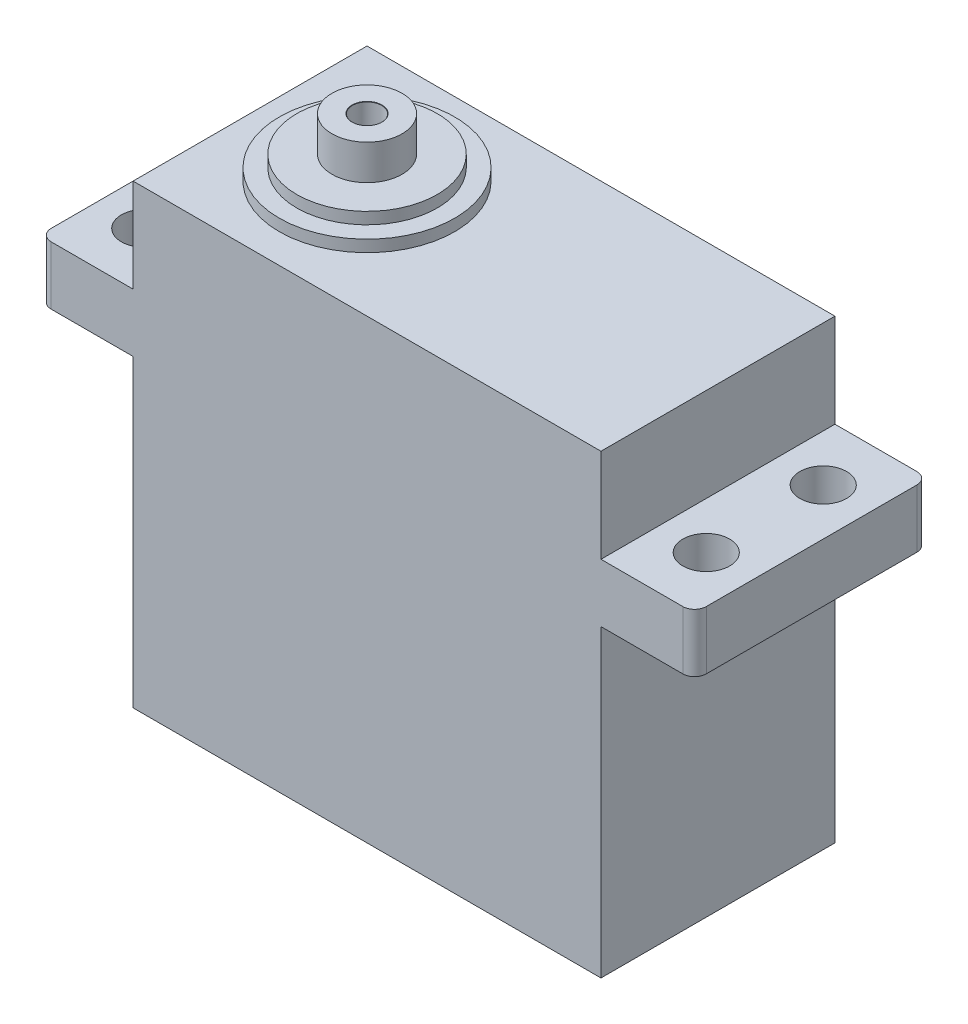
ISO-10303-21;
HEADER;
FILE_DESCRIPTION(('STEP AP214'),'2;1');
FILE_NAME('part.step','',(''),(''),'','','');
FILE_SCHEMA(('AUTOMOTIVE_DESIGN { 1 0 10303 214 1 1 1 1 }'));
ENDSEC;
DATA;
#1=APPLICATION_CONTEXT('core data for automotive mechanical design processes');
#2=APPLICATION_PROTOCOL_DEFINITION('international standard','automotive_design',2000,#1);
#3=PRODUCT_CONTEXT('',#1,'mechanical');
#4=PRODUCT('Part','Part','',(#3));
#5=PRODUCT_RELATED_PRODUCT_CATEGORY('part','',(#4));
#6=PRODUCT_DEFINITION_FORMATION('','',#4);
#7=PRODUCT_DEFINITION_CONTEXT('part definition',#1,'design');
#8=PRODUCT_DEFINITION('design','',#6,#7);
#9=PRODUCT_DEFINITION_SHAPE('','',#8);
#10=(LENGTH_UNIT() NAMED_UNIT(*) SI_UNIT(.MILLI.,.METRE.));
#11=(NAMED_UNIT(*) PLANE_ANGLE_UNIT() SI_UNIT($,.RADIAN.));
#12=(NAMED_UNIT(*) SI_UNIT($,.STERADIAN.) SOLID_ANGLE_UNIT());
#13=UNCERTAINTY_MEASURE_WITH_UNIT(LENGTH_MEASURE(1.E-05),#10,'distance_accuracy_value','');
#14=(GEOMETRIC_REPRESENTATION_CONTEXT(3) GLOBAL_UNCERTAINTY_ASSIGNED_CONTEXT((#13)) GLOBAL_UNIT_ASSIGNED_CONTEXT((#10,
#11,#12)) REPRESENTATION_CONTEXT('',''));
#15=CARTESIAN_POINT('',(0.,0.,0.));
#16=DIRECTION('',(0.,0.,1.));
#17=DIRECTION('',(1.,0.,0.));
#18=AXIS2_PLACEMENT_3D('',#15,#16,#17);
#19=CARTESIAN_POINT('',(0.,31.,20.));
#20=DIRECTION('',(0.,1.,0.));
#21=DIRECTION('',(0.,0.,1.));
#22=AXIS2_PLACEMENT_3D('',#19,#20,#21);
#23=PLANE('',#22);
#24=DIRECTION('',(0.,0.,-1.));
#25=VECTOR('',#24,1.);
#26=CARTESIAN_POINT('',(48.,31.,20.));
#27=LINE('',#26,#25);
#28=CARTESIAN_POINT('',(48.,31.,19.));
#29=VERTEX_POINT('',#28);
#30=CARTESIAN_POINT('',(48.,31.,1.));
#31=VERTEX_POINT('',#30);
#32=EDGE_CURVE('E276',#29,#31,#27,.T.);
#33=ORIENTED_EDGE('',*,*,#32,.T.);
#34=CARTESIAN_POINT('',(47.,31.,1.));
#35=DIRECTION('',(0.,1.,0.));
#36=DIRECTION('',(0.,0.,1.));
#37=AXIS2_PLACEMENT_3D('',#34,#35,#36);
#38=CIRCLE('',#37,1.);
#39=CARTESIAN_POINT('',(47.,31.,0.));
#40=VERTEX_POINT('',#39);
#41=EDGE_CURVE('E389',#31,#40,#38,.T.);
#42=ORIENTED_EDGE('',*,*,#41,.T.);
#43=DIRECTION('',(1.,0.,0.));
#44=VECTOR('',#43,1.);
#45=CARTESIAN_POINT('',(0.,31.,0.));
#46=LINE('',#45,#44);
#47=CARTESIAN_POINT('',(40.,31.,0.));
#48=VERTEX_POINT('',#47);
#49=EDGE_CURVE('E229',#48,#40,#46,.T.);
#50=ORIENTED_EDGE('',*,*,#49,.F.);
#51=DIRECTION('',(0.,0.,-1.));
#52=VECTOR('',#51,1.);
#53=CARTESIAN_POINT('',(40.,31.,20.));
#54=LINE('',#53,#52);
#55=CARTESIAN_POINT('',(40.,31.,20.));
#56=VERTEX_POINT('',#55);
#57=EDGE_CURVE('E273',#56,#48,#54,.T.);
#58=ORIENTED_EDGE('',*,*,#57,.F.);
#59=DIRECTION('',(1.,0.,0.));
#60=VECTOR('',#59,1.);
#61=CARTESIAN_POINT('',(0.,31.,20.));
#62=LINE('',#61,#60);
#63=CARTESIAN_POINT('',(47.,31.,20.));
#64=VERTEX_POINT('',#63);
#65=EDGE_CURVE('E247',#56,#64,#62,.T.);
#66=ORIENTED_EDGE('',*,*,#65,.T.);
#67=CARTESIAN_POINT('',(47.,31.,19.));
#68=DIRECTION('',(0.,1.,0.));
#69=DIRECTION('',(0.,0.,1.));
#70=AXIS2_PLACEMENT_3D('',#67,#68,#69);
#71=CIRCLE('',#70,1.);
#72=EDGE_CURVE('E103',#64,#29,#71,.T.);
#73=ORIENTED_EDGE('',*,*,#72,.T.);
#74=EDGE_LOOP('',(#33,#42,#50,#58,#66,#73));
#75=FACE_BOUND('',#74,.T.);
#76=CARTESIAN_POINT('',(44.,31.,15.));
#77=DIRECTION('',(0.,1.,0.));
#78=DIRECTION('',(0.,0.,1.));
#79=AXIS2_PLACEMENT_3D('',#76,#77,#78);
#80=CIRCLE('',#79,2.00000000000001);
#81=CARTESIAN_POINT('',(44.,31.,17.));
#82=VERTEX_POINT('',#81);
#83=EDGE_CURVE('E336',#82,#82,#80,.T.);
#84=ORIENTED_EDGE('',*,*,#83,.F.);
#85=EDGE_LOOP('',(#84));
#86=FACE_BOUND('',#85,.T.);
#87=CARTESIAN_POINT('',(44.,31.,5.));
#88=DIRECTION('',(0.,1.,0.));
#89=DIRECTION('',(0.,0.,1.));
#90=AXIS2_PLACEMENT_3D('',#87,#88,#89);
#91=CIRCLE('',#90,2.00000000000001);
#92=CARTESIAN_POINT('',(44.,31.,7.00000000000001));
#93=VERTEX_POINT('',#92);
#94=EDGE_CURVE('E325',#93,#93,#91,.F.);
#95=ORIENTED_EDGE('',*,*,#94,.T.);
#96=EDGE_LOOP('',(#95));
#97=FACE_BOUND('',#96,.T.);
#98=ADVANCED_FACE('F79',(#75,#86,#97),#23,.T.);
#99=CARTESIAN_POINT('',(0.,26.0155763239875,20.));
#100=DIRECTION('',(0.,1.,0.));
#101=DIRECTION('',(0.,0.,1.));
#102=AXIS2_PLACEMENT_3D('',#99,#100,#101);
#103=PLANE('',#102);
#104=CARTESIAN_POINT('',(44.,26.0155763239875,15.));
#105=DIRECTION('',(0.,1.,0.));
#106=DIRECTION('',(0.,0.,1.));
#107=AXIS2_PLACEMENT_3D('',#104,#105,#106);
#108=CIRCLE('',#107,2.00000000000001);
#109=CARTESIAN_POINT('',(44.,26.0155763239875,17.));
#110=VERTEX_POINT('',#109);
#111=EDGE_CURVE('E332',#110,#110,#108,.T.);
#112=ORIENTED_EDGE('',*,*,#111,.T.);
#113=EDGE_LOOP('',(#112));
#114=FACE_BOUND('',#113,.T.);
#115=DIRECTION('',(1.,0.,0.));
#116=VECTOR('',#115,1.);
#117=CARTESIAN_POINT('',(0.,26.0155763239875,0.));
#118=LINE('',#117,#116);
#119=CARTESIAN_POINT('',(40.,26.0155763239875,0.));
#120=VERTEX_POINT('',#119);
#121=CARTESIAN_POINT('',(47.,26.0155763239875,0.));
#122=VERTEX_POINT('',#121);
#123=EDGE_CURVE('E263',#120,#122,#118,.T.);
#124=ORIENTED_EDGE('',*,*,#123,.T.);
#125=CARTESIAN_POINT('',(47.,26.0155763239875,1.));
#126=DIRECTION('',(0.,1.,0.));
#127=DIRECTION('',(0.,0.,1.));
#128=AXIS2_PLACEMENT_3D('',#125,#126,#127);
#129=CIRCLE('',#128,1.);
#130=CARTESIAN_POINT('',(48.,26.0155763239875,1.));
#131=VERTEX_POINT('',#130);
#132=EDGE_CURVE('E88',#122,#131,#129,.F.);
#133=ORIENTED_EDGE('',*,*,#132,.T.);
#134=DIRECTION('',(0.,0.,-1.));
#135=VECTOR('',#134,1.);
#136=CARTESIAN_POINT('',(48.,26.0155763239875,20.));
#137=LINE('',#136,#135);
#138=CARTESIAN_POINT('',(48.,26.0155763239875,19.));
#139=VERTEX_POINT('',#138);
#140=EDGE_CURVE('E280',#139,#131,#137,.T.);
#141=ORIENTED_EDGE('',*,*,#140,.F.);
#142=CARTESIAN_POINT('',(47.,26.0155763239875,19.));
#143=DIRECTION('',(0.,1.,0.));
#144=DIRECTION('',(0.,0.,1.));
#145=AXIS2_PLACEMENT_3D('',#142,#143,#144);
#146=CIRCLE('',#145,1.);
#147=CARTESIAN_POINT('',(47.,26.0155763239875,20.));
#148=VERTEX_POINT('',#147);
#149=EDGE_CURVE('E95',#139,#148,#146,.F.);
#150=ORIENTED_EDGE('',*,*,#149,.T.);
#151=DIRECTION('',(1.,0.,0.));
#152=VECTOR('',#151,1.);
#153=CARTESIAN_POINT('',(0.,26.0155763239875,20.));
#154=LINE('',#153,#152);
#155=CARTESIAN_POINT('',(40.,26.0155763239875,20.));
#156=VERTEX_POINT('',#155);
#157=EDGE_CURVE('E244',#156,#148,#154,.T.);
#158=ORIENTED_EDGE('',*,*,#157,.F.);
#159=DIRECTION('',(0.,0.,-1.));
#160=VECTOR('',#159,1.);
#161=CARTESIAN_POINT('',(40.,26.0155763239875,20.));
#162=LINE('',#161,#160);
#163=EDGE_CURVE('E284',#156,#120,#162,.T.);
#164=ORIENTED_EDGE('',*,*,#163,.T.);
#165=EDGE_LOOP('',(#124,#133,#141,#150,#158,#164));
#166=FACE_BOUND('',#165,.T.);
#167=CARTESIAN_POINT('',(44.,26.0155763239875,5.));
#168=DIRECTION('',(0.,1.,0.));
#169=DIRECTION('',(0.,0.,1.));
#170=AXIS2_PLACEMENT_3D('',#167,#168,#169);
#171=CIRCLE('',#170,2.00000000000001);
#172=CARTESIAN_POINT('',(44.,26.0155763239875,7.00000000000001));
#173=VERTEX_POINT('',#172);
#174=EDGE_CURVE('E337',#173,#173,#171,.F.);
#175=ORIENTED_EDGE('',*,*,#174,.F.);
#176=EDGE_LOOP('',(#175));
#177=FACE_BOUND('',#176,.T.);
#178=ADVANCED_FACE('F395',(#114,#166,#177),#103,.F.);
#179=CARTESIAN_POINT('',(40.,0.,20.));
#180=DIRECTION('',(-1.,0.,0.));
#181=DIRECTION('',(0.,0.,1.));
#182=AXIS2_PLACEMENT_3D('',#179,#180,#181);
#183=PLANE('',#182);
#184=DIRECTION('',(0.,1.,0.));
#185=VECTOR('',#184,1.);
#186=CARTESIAN_POINT('',(40.,0.,0.));
#187=LINE('',#186,#185);
#188=CARTESIAN_POINT('',(40.,39.,0.));
#189=VERTEX_POINT('',#188);
#190=EDGE_CURVE('E225',#48,#189,#187,.T.);
#191=ORIENTED_EDGE('',*,*,#190,.T.);
#192=DIRECTION('',(0.,0.,-1.));
#193=VECTOR('',#192,1.);
#194=CARTESIAN_POINT('',(40.,39.,20.));
#195=LINE('',#194,#193);
#196=CARTESIAN_POINT('',(40.,39.,20.));
#197=VERTEX_POINT('',#196);
#198=EDGE_CURVE('E270',#197,#189,#195,.T.);
#199=ORIENTED_EDGE('',*,*,#198,.F.);
#200=DIRECTION('',(0.,1.,0.));
#201=VECTOR('',#200,1.);
#202=CARTESIAN_POINT('',(40.,0.,20.));
#203=LINE('',#202,#201);
#204=EDGE_CURVE('E222',#56,#197,#203,.T.);
#205=ORIENTED_EDGE('',*,*,#204,.F.);
#206=ORIENTED_EDGE('',*,*,#57,.T.);
#207=EDGE_LOOP('',(#191,#199,#205,#206));
#208=FACE_BOUND('',#207,.T.);
#209=ADVANCED_FACE('F412',(#208),#183,.F.);
#210=CARTESIAN_POINT('',(48.,0.,20.));
#211=DIRECTION('',(-1.,0.,0.));
#212=DIRECTION('',(0.,0.,1.));
#213=AXIS2_PLACEMENT_3D('',#210,#211,#212);
#214=PLANE('',#213);
#215=ORIENTED_EDGE('',*,*,#140,.T.);
#216=DIRECTION('',(0.,1.,0.));
#217=VECTOR('',#216,1.);
#218=CARTESIAN_POINT('',(48.,0.,1.));
#219=LINE('',#218,#217);
#220=EDGE_CURVE('E383',#131,#31,#219,.T.);
#221=ORIENTED_EDGE('',*,*,#220,.T.);
#222=ORIENTED_EDGE('',*,*,#32,.F.);
#223=DIRECTION('',(0.,1.,0.));
#224=VECTOR('',#223,1.);
#225=CARTESIAN_POINT('',(48.,26.0155763239875,19.));
#226=LINE('',#225,#224);
#227=EDGE_CURVE('E380',#29,#139,#226,.F.);
#228=ORIENTED_EDGE('',*,*,#227,.T.);
#229=EDGE_LOOP('',(#215,#221,#222,#228));
#230=FACE_BOUND('',#229,.T.);
#231=ADVANCED_FACE('F402',(#230),#214,.F.);
#232=CARTESIAN_POINT('',(40.,0.,0.));
#233=VERTEX_POINT('',#232);
#234=EDGE_CURVE('E231',#233,#120,#187,.T.);
#235=ORIENTED_EDGE('',*,*,#234,.T.);
#236=ORIENTED_EDGE('',*,*,#163,.F.);
#237=CARTESIAN_POINT('',(40.,0.,20.));
#238=VERTEX_POINT('',#237);
#239=EDGE_CURVE('E241',#238,#156,#203,.T.);
#240=ORIENTED_EDGE('',*,*,#239,.F.);
#241=DIRECTION('',(0.,0.,-1.));
#242=VECTOR('',#241,1.);
#243=CARTESIAN_POINT('',(40.,0.,20.));
#244=LINE('',#243,#242);
#245=EDGE_CURVE('E288',#238,#233,#244,.T.);
#246=ORIENTED_EDGE('',*,*,#245,.T.);
#247=EDGE_LOOP('',(#235,#236,#240,#246));
#248=FACE_BOUND('',#247,.T.);
#249=ADVANCED_FACE('F429',(#248),#183,.F.);
#250=CARTESIAN_POINT('',(0.,39.,20.));
#251=DIRECTION('',(0.,1.,0.));
#252=DIRECTION('',(0.,0.,1.));
#253=AXIS2_PLACEMENT_3D('',#250,#251,#252);
#254=PLANE('',#253);
#255=CARTESIAN_POINT('',(10.,39.,10.));
#256=DIRECTION('',(0.,1.,0.));
#257=DIRECTION('',(0.,0.,1.));
#258=AXIS2_PLACEMENT_3D('',#255,#256,#257);
#259=CIRCLE('',#258,7.5);
#260=CARTESIAN_POINT('',(10.,39.,17.5));
#261=VERTEX_POINT('',#260);
#262=EDGE_CURVE('E345',#261,#261,#259,.T.);
#263=ORIENTED_EDGE('',*,*,#262,.F.);
#264=EDGE_LOOP('',(#263));
#265=FACE_BOUND('',#264,.T.);
#266=DIRECTION('',(1.,0.,0.));
#267=VECTOR('',#266,1.);
#268=CARTESIAN_POINT('',(0.,39.,0.));
#269=LINE('',#268,#267);
#270=CARTESIAN_POINT('',(0.,39.,0.));
#271=VERTEX_POINT('',#270);
#272=EDGE_CURVE('E214',#271,#189,#269,.T.);
#273=ORIENTED_EDGE('',*,*,#272,.F.);
#274=DIRECTION('',(0.,0.,-1.));
#275=VECTOR('',#274,1.);
#276=CARTESIAN_POINT('',(0.,39.,20.));
#277=LINE('',#276,#275);
#278=CARTESIAN_POINT('',(0.,39.,20.));
#279=VERTEX_POINT('',#278);
#280=EDGE_CURVE('E199',#279,#271,#277,.T.);
#281=ORIENTED_EDGE('',*,*,#280,.F.);
#282=DIRECTION('',(1.,0.,0.));
#283=VECTOR('',#282,1.);
#284=CARTESIAN_POINT('',(0.,39.,20.));
#285=LINE('',#284,#283);
#286=EDGE_CURVE('E208',#279,#197,#285,.T.);
#287=ORIENTED_EDGE('',*,*,#286,.T.);
#288=ORIENTED_EDGE('',*,*,#198,.T.);
#289=EDGE_LOOP('',(#273,#281,#287,#288));
#290=FACE_BOUND('',#289,.T.);
#291=ADVANCED_FACE('F212',(#265,#290),#254,.T.);
#292=CARTESIAN_POINT('',(0.,0.,20.));
#293=DIRECTION('',(0.,1.,0.));
#294=DIRECTION('',(0.,0.,1.));
#295=AXIS2_PLACEMENT_3D('',#292,#293,#294);
#296=PLANE('',#295);
#297=DIRECTION('',(1.,0.,0.));
#298=VECTOR('',#297,1.);
#299=CARTESIAN_POINT('',(0.,0.,0.));
#300=LINE('',#299,#298);
#301=CARTESIAN_POINT('',(0.,0.,0.));
#302=VERTEX_POINT('',#301);
#303=EDGE_CURVE('E259',#302,#233,#300,.T.);
#304=ORIENTED_EDGE('',*,*,#303,.T.);
#305=ORIENTED_EDGE('',*,*,#245,.F.);
#306=DIRECTION('',(1.,0.,0.));
#307=VECTOR('',#306,1.);
#308=CARTESIAN_POINT('',(0.,0.,20.));
#309=LINE('',#308,#307);
#310=CARTESIAN_POINT('',(0.,0.,20.));
#311=VERTEX_POINT('',#310);
#312=EDGE_CURVE('E238',#311,#238,#309,.T.);
#313=ORIENTED_EDGE('',*,*,#312,.F.);
#314=DIRECTION('',(0.,0.,-1.));
#315=VECTOR('',#314,1.);
#316=CARTESIAN_POINT('',(0.,0.,20.));
#317=LINE('',#316,#315);
#318=EDGE_CURVE('E217',#311,#302,#317,.T.);
#319=ORIENTED_EDGE('',*,*,#318,.T.);
#320=EDGE_LOOP('',(#304,#305,#313,#319));
#321=FACE_BOUND('',#320,.T.);
#322=ADVANCED_FACE('F431',(#321),#296,.F.);
#323=CARTESIAN_POINT('',(0.,0.,0.));
#324=DIRECTION('',(0.,0.,1.));
#325=DIRECTION('',(1.,0.,0.));
#326=AXIS2_PLACEMENT_3D('',#323,#324,#325);
#327=PLANE('',#326);
#328=DIRECTION('',(-1.,0.,0.));
#329=VECTOR('',#328,1.);
#330=CARTESIAN_POINT('',(0.,26.0155763239875,0.));
#331=LINE('',#330,#329);
#332=CARTESIAN_POINT('',(0.,26.0155763239875,0.));
#333=VERTEX_POINT('',#332);
#334=CARTESIAN_POINT('',(-7.,26.0155763239875,0.));
#335=VERTEX_POINT('',#334);
#336=EDGE_CURVE('E303',#333,#335,#331,.T.);
#337=ORIENTED_EDGE('',*,*,#336,.T.);
#338=DIRECTION('',(0.,1.,0.));
#339=VECTOR('',#338,1.);
#340=CARTESIAN_POINT('',(-7.,31.,0.));
#341=LINE('',#340,#339);
#342=CARTESIAN_POINT('',(-7.,31.,0.));
#343=VERTEX_POINT('',#342);
#344=EDGE_CURVE('E367',#335,#343,#341,.T.);
#345=ORIENTED_EDGE('',*,*,#344,.T.);
#346=DIRECTION('',(-1.,0.,0.));
#347=VECTOR('',#346,1.);
#348=CARTESIAN_POINT('',(0.,31.,0.));
#349=LINE('',#348,#347);
#350=CARTESIAN_POINT('',(0.,31.,0.));
#351=VERTEX_POINT('',#350);
#352=EDGE_CURVE('E299',#351,#343,#349,.T.);
#353=ORIENTED_EDGE('',*,*,#352,.F.);
#354=DIRECTION('',(0.,1.,0.));
#355=VECTOR('',#354,1.);
#356=CARTESIAN_POINT('',(0.,0.,0.));
#357=LINE('',#356,#355);
#358=EDGE_CURVE('E253',#351,#271,#357,.T.);
#359=ORIENTED_EDGE('',*,*,#358,.T.);
#360=ORIENTED_EDGE('',*,*,#272,.T.);
#361=ORIENTED_EDGE('',*,*,#190,.F.);
#362=ORIENTED_EDGE('',*,*,#49,.T.);
#363=DIRECTION('',(0.,1.,0.));
#364=VECTOR('',#363,1.);
#365=CARTESIAN_POINT('',(47.,0.,0.));
#366=LINE('',#365,#364);
#367=EDGE_CURVE('E364',#40,#122,#366,.F.);
#368=ORIENTED_EDGE('',*,*,#367,.T.);
#369=ORIENTED_EDGE('',*,*,#123,.F.);
#370=ORIENTED_EDGE('',*,*,#234,.F.);
#371=ORIENTED_EDGE('',*,*,#303,.F.);
#372=EDGE_CURVE('E255',#302,#333,#357,.T.);
#373=ORIENTED_EDGE('',*,*,#372,.T.);
#374=EDGE_LOOP('',(#337,#345,#353,#359,#360,#361,#362,#368,#369,#370,#371,#373));
#375=FACE_BOUND('',#374,.T.);
#376=ADVANCED_FACE('F410',(#375),#327,.F.);
#377=CARTESIAN_POINT('',(0.,0.,20.));
#378=DIRECTION('',(0.,0.,1.));
#379=DIRECTION('',(1.,0.,0.));
#380=AXIS2_PLACEMENT_3D('',#377,#378,#379);
#381=PLANE('',#380);
#382=ORIENTED_EDGE('',*,*,#157,.T.);
#383=DIRECTION('',(0.,1.,0.));
#384=VECTOR('',#383,1.);
#385=CARTESIAN_POINT('',(47.,31.,20.));
#386=LINE('',#385,#384);
#387=EDGE_CURVE('E12',#148,#64,#386,.T.);
#388=ORIENTED_EDGE('',*,*,#387,.T.);
#389=ORIENTED_EDGE('',*,*,#65,.F.);
#390=ORIENTED_EDGE('',*,*,#204,.T.);
#391=ORIENTED_EDGE('',*,*,#286,.F.);
#392=DIRECTION('',(0.,1.,0.));
#393=VECTOR('',#392,1.);
#394=CARTESIAN_POINT('',(0.,0.,20.));
#395=LINE('',#394,#393);
#396=CARTESIAN_POINT('',(0.,31.,20.));
#397=VERTEX_POINT('',#396);
#398=EDGE_CURVE('E195',#397,#279,#395,.T.);
#399=ORIENTED_EDGE('',*,*,#398,.F.);
#400=DIRECTION('',(-1.,0.,0.));
#401=VECTOR('',#400,1.);
#402=CARTESIAN_POINT('',(0.,31.,20.));
#403=LINE('',#402,#401);
#404=CARTESIAN_POINT('',(-7.,31.,20.));
#405=VERTEX_POINT('',#404);
#406=EDGE_CURVE('E298',#397,#405,#403,.T.);
#407=ORIENTED_EDGE('',*,*,#406,.T.);
#408=DIRECTION('',(0.,1.,0.));
#409=VECTOR('',#408,1.);
#410=CARTESIAN_POINT('',(-7.,0.,20.));
#411=LINE('',#410,#409);
#412=CARTESIAN_POINT('',(-7.,26.0155763239875,20.));
#413=VERTEX_POINT('',#412);
#414=EDGE_CURVE('E358',#405,#413,#411,.F.);
#415=ORIENTED_EDGE('',*,*,#414,.T.);
#416=DIRECTION('',(-1.,0.,0.));
#417=VECTOR('',#416,1.);
#418=CARTESIAN_POINT('',(0.,26.0155763239875,20.));
#419=LINE('',#418,#417);
#420=CARTESIAN_POINT('',(0.,26.0155763239875,20.));
#421=VERTEX_POINT('',#420);
#422=EDGE_CURVE('E294',#421,#413,#419,.T.);
#423=ORIENTED_EDGE('',*,*,#422,.F.);
#424=EDGE_CURVE('E207',#311,#421,#395,.T.);
#425=ORIENTED_EDGE('',*,*,#424,.F.);
#426=ORIENTED_EDGE('',*,*,#312,.T.);
#427=ORIENTED_EDGE('',*,*,#239,.T.);
#428=EDGE_LOOP('',(#382,#388,#389,#390,#391,#399,#407,#415,#423,#425,#426,#427));
#429=FACE_BOUND('',#428,.T.);
#430=ADVANCED_FACE('F219',(#429),#381,.T.);
#431=CARTESIAN_POINT('',(0.,0.,20.));
#432=DIRECTION('',(-1.,0.,0.));
#433=DIRECTION('',(0.,0.,1.));
#434=AXIS2_PLACEMENT_3D('',#431,#432,#433);
#435=PLANE('',#434);
#436=ORIENTED_EDGE('',*,*,#424,.T.);
#437=DIRECTION('',(0.,0.,-1.));
#438=VECTOR('',#437,1.);
#439=CARTESIAN_POINT('',(0.,26.0155763239875,20.));
#440=LINE('',#439,#438);
#441=EDGE_CURVE('E216',#421,#333,#440,.T.);
#442=ORIENTED_EDGE('',*,*,#441,.T.);
#443=ORIENTED_EDGE('',*,*,#372,.F.);
#444=ORIENTED_EDGE('',*,*,#318,.F.);
#445=EDGE_LOOP('',(#436,#442,#443,#444));
#446=FACE_BOUND('',#445,.T.);
#447=ADVANCED_FACE('F438',(#446),#435,.T.);
#448=DIRECTION('',(0.,0.,-1.));
#449=VECTOR('',#448,1.);
#450=CARTESIAN_POINT('',(0.,31.,20.));
#451=LINE('',#450,#449);
#452=EDGE_CURVE('E201',#397,#351,#451,.T.);
#453=ORIENTED_EDGE('',*,*,#452,.F.);
#454=ORIENTED_EDGE('',*,*,#398,.T.);
#455=ORIENTED_EDGE('',*,*,#280,.T.);
#456=ORIENTED_EDGE('',*,*,#358,.F.);
#457=EDGE_LOOP('',(#453,#454,#455,#456));
#458=FACE_BOUND('',#457,.T.);
#459=ADVANCED_FACE('F197',(#458),#435,.T.);
#460=CARTESIAN_POINT('',(-8.,26.0155763239875,20.));
#461=DIRECTION('',(-1.,0.,0.));
#462=DIRECTION('',(0.,0.,1.));
#463=AXIS2_PLACEMENT_3D('',#460,#461,#462);
#464=PLANE('',#463);
#465=DIRECTION('',(0.,0.,-1.));
#466=VECTOR('',#465,1.);
#467=CARTESIAN_POINT('',(-8.,31.,20.));
#468=LINE('',#467,#466);
#469=CARTESIAN_POINT('',(-8.,31.,19.));
#470=VERTEX_POINT('',#469);
#471=CARTESIAN_POINT('',(-8.,31.,1.));
#472=VERTEX_POINT('',#471);
#473=EDGE_CURVE('E254',#470,#472,#468,.T.);
#474=ORIENTED_EDGE('',*,*,#473,.T.);
#475=DIRECTION('',(0.,1.,0.));
#476=VECTOR('',#475,1.);
#477=CARTESIAN_POINT('',(-8.,26.0155763239875,1.));
#478=LINE('',#477,#476);
#479=CARTESIAN_POINT('',(-8.,26.0155763239875,1.));
#480=VERTEX_POINT('',#479);
#481=EDGE_CURVE('E374',#472,#480,#478,.F.);
#482=ORIENTED_EDGE('',*,*,#481,.T.);
#483=DIRECTION('',(0.,0.,-1.));
#484=VECTOR('',#483,1.);
#485=CARTESIAN_POINT('',(-8.,26.0155763239875,20.));
#486=LINE('',#485,#484);
#487=CARTESIAN_POINT('',(-8.,26.0155763239875,19.));
#488=VERTEX_POINT('',#487);
#489=EDGE_CURVE('E302',#488,#480,#486,.T.);
#490=ORIENTED_EDGE('',*,*,#489,.F.);
#491=DIRECTION('',(0.,1.,0.));
#492=VECTOR('',#491,1.);
#493=CARTESIAN_POINT('',(-8.,26.0155763239875,19.));
#494=LINE('',#493,#492);
#495=EDGE_CURVE('E314',#488,#470,#494,.T.);
#496=ORIENTED_EDGE('',*,*,#495,.T.);
#497=EDGE_LOOP('',(#474,#482,#490,#496));
#498=FACE_BOUND('',#497,.T.);
#499=ADVANCED_FACE('F437',(#498),#464,.T.);
#500=CARTESIAN_POINT('',(0.,26.0155763239875,20.));
#501=DIRECTION('',(0.,-1.,0.));
#502=DIRECTION('',(0.,0.,-1.));
#503=AXIS2_PLACEMENT_3D('',#500,#501,#502);
#504=PLANE('',#503);
#505=CARTESIAN_POINT('',(-4.,26.0155763239875,5.));
#506=DIRECTION('',(0.,-1.,0.));
#507=DIRECTION('',(0.,0.,-1.));
#508=AXIS2_PLACEMENT_3D('',#505,#506,#507);
#509=CIRCLE('',#508,2.);
#510=CARTESIAN_POINT('',(-4.,26.0155763239875,3.));
#511=VERTEX_POINT('',#510);
#512=EDGE_CURVE('E330',#511,#511,#509,.T.);
#513=ORIENTED_EDGE('',*,*,#512,.F.);
#514=EDGE_LOOP('',(#513));
#515=FACE_BOUND('',#514,.T.);
#516=CARTESIAN_POINT('',(-4.,26.0155763239875,15.));
#517=DIRECTION('',(0.,-1.,0.));
#518=DIRECTION('',(0.,0.,-1.));
#519=AXIS2_PLACEMENT_3D('',#516,#517,#518);
#520=CIRCLE('',#519,2.);
#521=CARTESIAN_POINT('',(-4.,26.0155763239875,13.));
#522=VERTEX_POINT('',#521);
#523=EDGE_CURVE('E233',#522,#522,#520,.F.);
#524=ORIENTED_EDGE('',*,*,#523,.T.);
#525=EDGE_LOOP('',(#524));
#526=FACE_BOUND('',#525,.T.);
#527=ORIENTED_EDGE('',*,*,#489,.T.);
#528=CARTESIAN_POINT('',(-7.,26.0155763239875,1.));
#529=DIRECTION('',(0.,-1.,0.));
#530=DIRECTION('',(0.,0.,-1.));
#531=AXIS2_PLACEMENT_3D('',#528,#529,#530);
#532=CIRCLE('',#531,1.);
#533=EDGE_CURVE('E377',#480,#335,#532,.T.);
#534=ORIENTED_EDGE('',*,*,#533,.T.);
#535=ORIENTED_EDGE('',*,*,#336,.F.);
#536=ORIENTED_EDGE('',*,*,#441,.F.);
#537=ORIENTED_EDGE('',*,*,#422,.T.);
#538=CARTESIAN_POINT('',(-7.,26.0155763239875,19.));
#539=DIRECTION('',(0.,-1.,0.));
#540=DIRECTION('',(0.,0.,-1.));
#541=AXIS2_PLACEMENT_3D('',#538,#539,#540);
#542=CIRCLE('',#541,1.);
#543=EDGE_CURVE('E361',#413,#488,#542,.T.);
#544=ORIENTED_EDGE('',*,*,#543,.T.);
#545=EDGE_LOOP('',(#527,#534,#535,#536,#537,#544));
#546=FACE_BOUND('',#545,.T.);
#547=ADVANCED_FACE('F439',(#515,#526,#546),#504,.T.);
#548=CARTESIAN_POINT('',(0.,31.,20.));
#549=DIRECTION('',(0.,-1.,0.));
#550=DIRECTION('',(0.,0.,-1.));
#551=AXIS2_PLACEMENT_3D('',#548,#549,#550);
#552=PLANE('',#551);
#553=CARTESIAN_POINT('',(-4.,31.,5.));
#554=DIRECTION('',(0.,-1.,0.));
#555=DIRECTION('',(0.,0.,-1.));
#556=AXIS2_PLACEMENT_3D('',#553,#554,#555);
#557=CIRCLE('',#556,2.);
#558=CARTESIAN_POINT('',(-4.,31.,3.));
#559=VERTEX_POINT('',#558);
#560=EDGE_CURVE('E326',#559,#559,#557,.T.);
#561=ORIENTED_EDGE('',*,*,#560,.T.);
#562=EDGE_LOOP('',(#561));
#563=FACE_BOUND('',#562,.T.);
#564=CARTESIAN_POINT('',(-4.,31.,15.));
#565=DIRECTION('',(0.,-1.,0.));
#566=DIRECTION('',(0.,0.,-1.));
#567=AXIS2_PLACEMENT_3D('',#564,#565,#566);
#568=CIRCLE('',#567,2.);
#569=CARTESIAN_POINT('',(-4.,31.,13.));
#570=VERTEX_POINT('',#569);
#571=EDGE_CURVE('E321',#570,#570,#568,.F.);
#572=ORIENTED_EDGE('',*,*,#571,.F.);
#573=EDGE_LOOP('',(#572));
#574=FACE_BOUND('',#573,.T.);
#575=ORIENTED_EDGE('',*,*,#352,.T.);
#576=CARTESIAN_POINT('',(-7.,31.,1.));
#577=DIRECTION('',(0.,-1.,0.));
#578=DIRECTION('',(0.,0.,-1.));
#579=AXIS2_PLACEMENT_3D('',#576,#577,#578);
#580=CIRCLE('',#579,1.);
#581=EDGE_CURVE('E371',#343,#472,#580,.F.);
#582=ORIENTED_EDGE('',*,*,#581,.T.);
#583=ORIENTED_EDGE('',*,*,#473,.F.);
#584=CARTESIAN_POINT('',(-7.,31.,19.));
#585=DIRECTION('',(0.,-1.,0.));
#586=DIRECTION('',(0.,0.,-1.));
#587=AXIS2_PLACEMENT_3D('',#584,#585,#586);
#588=CIRCLE('',#587,1.);
#589=EDGE_CURVE('E355',#470,#405,#588,.F.);
#590=ORIENTED_EDGE('',*,*,#589,.T.);
#591=ORIENTED_EDGE('',*,*,#406,.F.);
#592=ORIENTED_EDGE('',*,*,#452,.T.);
#593=EDGE_LOOP('',(#575,#582,#583,#590,#591,#592));
#594=FACE_BOUND('',#593,.T.);
#595=ADVANCED_FACE('F443',(#563,#574,#594),#552,.F.);
#596=CARTESIAN_POINT('',(-4.,19.,15.));
#597=DIRECTION('',(0.,1.,0.));
#598=DIRECTION('',(0.,0.,1.));
#599=AXIS2_PLACEMENT_3D('',#596,#597,#598);
#600=CYLINDRICAL_SURFACE('',#599,2.);
#601=ORIENTED_EDGE('',*,*,#523,.F.);
#602=EDGE_LOOP('',(#601));
#603=FACE_BOUND('',#602,.T.);
#604=ORIENTED_EDGE('',*,*,#571,.T.);
#605=EDGE_LOOP('',(#604));
#606=FACE_BOUND('',#605,.T.);
#607=ADVANCED_FACE('F446',(#603,#606),#600,.F.);
#608=CARTESIAN_POINT('',(-4.,19.,5.));
#609=DIRECTION('',(0.,1.,0.));
#610=DIRECTION('',(0.,0.,1.));
#611=AXIS2_PLACEMENT_3D('',#608,#609,#610);
#612=CYLINDRICAL_SURFACE('',#611,2.);
#613=ORIENTED_EDGE('',*,*,#512,.T.);
#614=EDGE_LOOP('',(#613));
#615=FACE_BOUND('',#614,.T.);
#616=ORIENTED_EDGE('',*,*,#560,.F.);
#617=EDGE_LOOP('',(#616));
#618=FACE_BOUND('',#617,.T.);
#619=ADVANCED_FACE('F553',(#615,#618),#612,.F.);
#620=CARTESIAN_POINT('',(44.,19.,15.));
#621=DIRECTION('',(0.,1.,0.));
#622=DIRECTION('',(0.,0.,1.));
#623=AXIS2_PLACEMENT_3D('',#620,#621,#622);
#624=CYLINDRICAL_SURFACE('',#623,2.00000000000001);
#625=ORIENTED_EDGE('',*,*,#83,.T.);
#626=EDGE_LOOP('',(#625));
#627=FACE_BOUND('',#626,.T.);
#628=ORIENTED_EDGE('',*,*,#111,.F.);
#629=EDGE_LOOP('',(#628));
#630=FACE_BOUND('',#629,.T.);
#631=ADVANCED_FACE('F556',(#627,#630),#624,.F.);
#632=CARTESIAN_POINT('',(44.,19.,5.));
#633=DIRECTION('',(0.,1.,0.));
#634=DIRECTION('',(0.,0.,1.));
#635=AXIS2_PLACEMENT_3D('',#632,#633,#634);
#636=CYLINDRICAL_SURFACE('',#635,2.00000000000001);
#637=ORIENTED_EDGE('',*,*,#94,.F.);
#638=EDGE_LOOP('',(#637));
#639=FACE_BOUND('',#638,.T.);
#640=ORIENTED_EDGE('',*,*,#174,.T.);
#641=EDGE_LOOP('',(#640));
#642=FACE_BOUND('',#641,.T.);
#643=ADVANCED_FACE('F551',(#639,#642),#636,.F.);
#644=CARTESIAN_POINT('',(10.,40.,10.));
#645=DIRECTION('',(0.,-1.,0.));
#646=DIRECTION('',(0.,0.,-1.));
#647=AXIS2_PLACEMENT_3D('',#644,#645,#646);
#648=CYLINDRICAL_SURFACE('',#647,7.5);
#649=CARTESIAN_POINT('',(10.,40.,10.));
#650=DIRECTION('',(0.,1.,0.));
#651=DIRECTION('',(0.,0.,1.));
#652=AXIS2_PLACEMENT_3D('',#649,#650,#651);
#653=CIRCLE('',#652,7.5);
#654=CARTESIAN_POINT('',(10.,40.,17.5));
#655=VERTEX_POINT('',#654);
#656=EDGE_CURVE('E331',#655,#655,#653,.T.);
#657=ORIENTED_EDGE('',*,*,#656,.F.);
#658=EDGE_LOOP('',(#657));
#659=FACE_BOUND('',#658,.T.);
#660=ORIENTED_EDGE('',*,*,#262,.T.);
#661=EDGE_LOOP('',(#660));
#662=FACE_BOUND('',#661,.T.);
#663=ADVANCED_FACE('F547',(#659,#662),#648,.T.);
#664=CARTESIAN_POINT('',(10.,40.,10.));
#665=DIRECTION('',(0.,1.,0.));
#666=DIRECTION('',(0.,0.,1.));
#667=AXIS2_PLACEMENT_3D('',#664,#665,#666);
#668=PLANE('',#667);
#669=CARTESIAN_POINT('',(10.,40.,10.));
#670=DIRECTION('',(0.,1.,0.));
#671=DIRECTION('',(0.,0.,1.));
#672=AXIS2_PLACEMENT_3D('',#669,#670,#671);
#673=CIRCLE('',#672,6.);
#674=CARTESIAN_POINT('',(10.,40.,16.));
#675=VERTEX_POINT('',#674);
#676=EDGE_CURVE('E341',#675,#675,#673,.F.);
#677=ORIENTED_EDGE('',*,*,#676,.T.);
#678=EDGE_LOOP('',(#677));
#679=FACE_BOUND('',#678,.T.);
#680=ORIENTED_EDGE('',*,*,#656,.T.);
#681=EDGE_LOOP('',(#680));
#682=FACE_BOUND('',#681,.T.);
#683=ADVANCED_FACE('F543',(#679,#682),#668,.T.);
#684=CARTESIAN_POINT('',(10.,41.,10.));
#685=DIRECTION('',(0.,-1.,0.));
#686=DIRECTION('',(0.,0.,-1.));
#687=AXIS2_PLACEMENT_3D('',#684,#685,#686);
#688=CYLINDRICAL_SURFACE('',#687,6.);
#689=ORIENTED_EDGE('',*,*,#676,.F.);
#690=EDGE_LOOP('',(#689));
#691=FACE_BOUND('',#690,.T.);
#692=CARTESIAN_POINT('',(10.,41.,10.));
#693=DIRECTION('',(0.,1.,0.));
#694=DIRECTION('',(0.,0.,1.));
#695=AXIS2_PLACEMENT_3D('',#692,#693,#694);
#696=CIRCLE('',#695,6.);
#697=CARTESIAN_POINT('',(10.,41.,16.));
#698=VERTEX_POINT('',#697);
#699=EDGE_CURVE('E346',#698,#698,#696,.T.);
#700=ORIENTED_EDGE('',*,*,#699,.F.);
#701=EDGE_LOOP('',(#700));
#702=FACE_BOUND('',#701,.T.);
#703=ADVANCED_FACE('F535',(#691,#702),#688,.T.);
#704=CARTESIAN_POINT('',(10.,41.,10.));
#705=DIRECTION('',(0.,1.,0.));
#706=DIRECTION('',(0.,0.,1.));
#707=AXIS2_PLACEMENT_3D('',#704,#705,#706);
#708=PLANE('',#707);
#709=CARTESIAN_POINT('',(10.,41.,10.));
#710=DIRECTION('',(0.,1.,0.));
#711=DIRECTION('',(0.,0.,1.));
#712=AXIS2_PLACEMENT_3D('',#709,#710,#711);
#713=CIRCLE('',#712,3.);
#714=CARTESIAN_POINT('',(10.,41.,13.));
#715=VERTEX_POINT('',#714);
#716=EDGE_CURVE('E347',#715,#715,#713,.F.);
#717=ORIENTED_EDGE('',*,*,#716,.T.);
#718=EDGE_LOOP('',(#717));
#719=FACE_BOUND('',#718,.T.);
#720=ORIENTED_EDGE('',*,*,#699,.T.);
#721=EDGE_LOOP('',(#720));
#722=FACE_BOUND('',#721,.T.);
#723=ADVANCED_FACE('F529',(#719,#722),#708,.T.);
#724=CARTESIAN_POINT('',(10.,44.,10.));
#725=DIRECTION('',(0.,-1.,0.));
#726=DIRECTION('',(0.,0.,-1.));
#727=AXIS2_PLACEMENT_3D('',#724,#725,#726);
#728=CYLINDRICAL_SURFACE('',#727,3.);
#729=ORIENTED_EDGE('',*,*,#716,.F.);
#730=EDGE_LOOP('',(#729));
#731=FACE_BOUND('',#730,.T.);
#732=CARTESIAN_POINT('',(10.,44.,10.));
#733=DIRECTION('',(0.,1.,0.));
#734=DIRECTION('',(0.,0.,1.));
#735=AXIS2_PLACEMENT_3D('',#732,#733,#734);
#736=CIRCLE('',#735,3.);
#737=CARTESIAN_POINT('',(10.,44.,13.));
#738=VERTEX_POINT('',#737);
#739=EDGE_CURVE('E351',#738,#738,#736,.T.);
#740=ORIENTED_EDGE('',*,*,#739,.F.);
#741=EDGE_LOOP('',(#740));
#742=FACE_BOUND('',#741,.T.);
#743=ADVANCED_FACE('F524',(#731,#742),#728,.T.);
#744=CARTESIAN_POINT('',(10.,44.,10.));
#745=DIRECTION('',(0.,1.,0.));
#746=DIRECTION('',(0.,0.,1.));
#747=AXIS2_PLACEMENT_3D('',#744,#745,#746);
#748=PLANE('',#747);
#749=CARTESIAN_POINT('',(10.,44.,10.));
#750=DIRECTION('',(0.,1.,0.));
#751=DIRECTION('',(0.,0.,1.));
#752=AXIS2_PLACEMENT_3D('',#749,#750,#751);
#753=CIRCLE('',#752,1.275);
#754=CARTESIAN_POINT('',(10.,44.,11.275));
#755=VERTEX_POINT('',#754);
#756=EDGE_CURVE('E513',#755,#755,#753,.T.);
#757=ORIENTED_EDGE('',*,*,#756,.F.);
#758=EDGE_LOOP('',(#757));
#759=FACE_BOUND('',#758,.T.);
#760=ORIENTED_EDGE('',*,*,#739,.T.);
#761=EDGE_LOOP('',(#760));
#762=FACE_BOUND('',#761,.T.);
#763=ADVANCED_FACE('F520',(#759,#762),#748,.T.);
#764=CARTESIAN_POINT('',(10.,42.,10.));
#765=DIRECTION('',(0.,-1.,0.));
#766=DIRECTION('',(0.,0.,-1.));
#767=AXIS2_PLACEMENT_3D('',#764,#765,#766);
#768=PLANE('',#767);
#769=CARTESIAN_POINT('',(10.,42.,10.));
#770=DIRECTION('',(0.,1.,0.));
#771=DIRECTION('',(0.,0.,1.));
#772=AXIS2_PLACEMENT_3D('',#769,#770,#771);
#773=CIRCLE('',#772,1.25);
#774=CARTESIAN_POINT('',(10.,42.,11.25));
#775=VERTEX_POINT('',#774);
#776=EDGE_CURVE('E505',#775,#775,#773,.T.);
#777=ORIENTED_EDGE('',*,*,#776,.T.);
#778=EDGE_LOOP('',(#777));
#779=FACE_BOUND('',#778,.T.);
#780=ADVANCED_FACE('F523',(#779),#768,.F.);
#781=CARTESIAN_POINT('',(10.,44.,10.));
#782=DIRECTION('',(0.,1.,0.));
#783=DIRECTION('',(0.,0.,1.));
#784=AXIS2_PLACEMENT_3D('',#781,#782,#783);
#785=CYLINDRICAL_SURFACE('',#784,1.25);
#786=ORIENTED_EDGE('',*,*,#776,.F.);
#787=EDGE_LOOP('',(#786));
#788=FACE_BOUND('',#787,.T.);
#789=CARTESIAN_POINT('',(10.,43.975,10.));
#790=DIRECTION('',(0.,1.,0.));
#791=DIRECTION('',(0.,0.,1.));
#792=AXIS2_PLACEMENT_3D('',#789,#790,#791);
#793=CIRCLE('',#792,1.25);
#794=CARTESIAN_POINT('',(10.,43.975,11.25));
#795=VERTEX_POINT('',#794);
#796=EDGE_CURVE('E509',#795,#795,#793,.T.);
#797=ORIENTED_EDGE('',*,*,#796,.T.);
#798=EDGE_LOOP('',(#797));
#799=FACE_BOUND('',#798,.T.);
#800=ADVANCED_FACE('F654',(#788,#799),#785,.F.);
#801=CARTESIAN_POINT('',(10.,44.,10.));
#802=DIRECTION('',(0.,1.,0.));
#803=DIRECTION('',(0.,0.,1.));
#804=AXIS2_PLACEMENT_3D('',#801,#802,#803);
#805=CONICAL_SURFACE('',#804,1.275,0.785398163397379);
#806=ORIENTED_EDGE('',*,*,#796,.F.);
#807=EDGE_LOOP('',(#806));
#808=FACE_BOUND('',#807,.T.);
#809=ORIENTED_EDGE('',*,*,#756,.T.);
#810=EDGE_LOOP('',(#809));
#811=FACE_BOUND('',#810,.T.);
#812=ADVANCED_FACE('F457',(#808,#811),#805,.F.);
#813=CARTESIAN_POINT('',(-7.,26.0155763239875,19.));
#814=DIRECTION('',(0.,1.,0.));
#815=DIRECTION('',(0.,0.,1.));
#816=AXIS2_PLACEMENT_3D('',#813,#814,#815);
#817=CYLINDRICAL_SURFACE('',#816,1.);
#818=ORIENTED_EDGE('',*,*,#543,.F.);
#819=ORIENTED_EDGE('',*,*,#414,.F.);
#820=ORIENTED_EDGE('',*,*,#589,.F.);
#821=ORIENTED_EDGE('',*,*,#495,.F.);
#822=EDGE_LOOP('',(#818,#819,#820,#821));
#823=FACE_BOUND('',#822,.T.);
#824=ADVANCED_FACE('F454',(#823),#817,.T.);
#825=CARTESIAN_POINT('',(-7.,0.,1.));
#826=DIRECTION('',(0.,-1.,0.));
#827=DIRECTION('',(0.,0.,-1.));
#828=AXIS2_PLACEMENT_3D('',#825,#826,#827);
#829=CYLINDRICAL_SURFACE('',#828,1.);
#830=ORIENTED_EDGE('',*,*,#533,.F.);
#831=ORIENTED_EDGE('',*,*,#481,.F.);
#832=ORIENTED_EDGE('',*,*,#581,.F.);
#833=ORIENTED_EDGE('',*,*,#344,.F.);
#834=EDGE_LOOP('',(#830,#831,#832,#833));
#835=FACE_BOUND('',#834,.T.);
#836=ADVANCED_FACE('F417',(#835),#829,.T.);
#837=CARTESIAN_POINT('',(47.,0.,1.));
#838=DIRECTION('',(0.,1.,0.));
#839=DIRECTION('',(0.,0.,1.));
#840=AXIS2_PLACEMENT_3D('',#837,#838,#839);
#841=CYLINDRICAL_SURFACE('',#840,1.);
#842=ORIENTED_EDGE('',*,*,#132,.F.);
#843=ORIENTED_EDGE('',*,*,#367,.F.);
#844=ORIENTED_EDGE('',*,*,#41,.F.);
#845=ORIENTED_EDGE('',*,*,#220,.F.);
#846=EDGE_LOOP('',(#842,#843,#844,#845));
#847=FACE_BOUND('',#846,.T.);
#848=ADVANCED_FACE('F404',(#847),#841,.T.);
#849=CARTESIAN_POINT('',(47.,0.,19.));
#850=DIRECTION('',(0.,-1.,0.));
#851=DIRECTION('',(0.,0.,-1.));
#852=AXIS2_PLACEMENT_3D('',#849,#850,#851);
#853=CYLINDRICAL_SURFACE('',#852,1.);
#854=ORIENTED_EDGE('',*,*,#149,.F.);
#855=ORIENTED_EDGE('',*,*,#227,.F.);
#856=ORIENTED_EDGE('',*,*,#72,.F.);
#857=ORIENTED_EDGE('',*,*,#387,.F.);
#858=EDGE_LOOP('',(#854,#855,#856,#857));
#859=FACE_BOUND('',#858,.T.);
#860=ADVANCED_FACE('F81',(#859),#853,.T.);
#861=CLOSED_SHELL('',(#98,#178,#209,#231,#249,#291,#322,#376,#430,#447,#459,#499,#547,#595,#607,
#619,#631,#643,#663,#683,#703,#723,#743,#763,#780,#800,#812,#824,#836,#848,#860));
#862=MANIFOLD_SOLID_BREP('B2',#861);
#863=ADVANCED_BREP_SHAPE_REPRESENTATION('',(#18,#862),#14);
#864=SHAPE_DEFINITION_REPRESENTATION(#9,#863);
ENDSEC;
END-ISO-10303-21;
